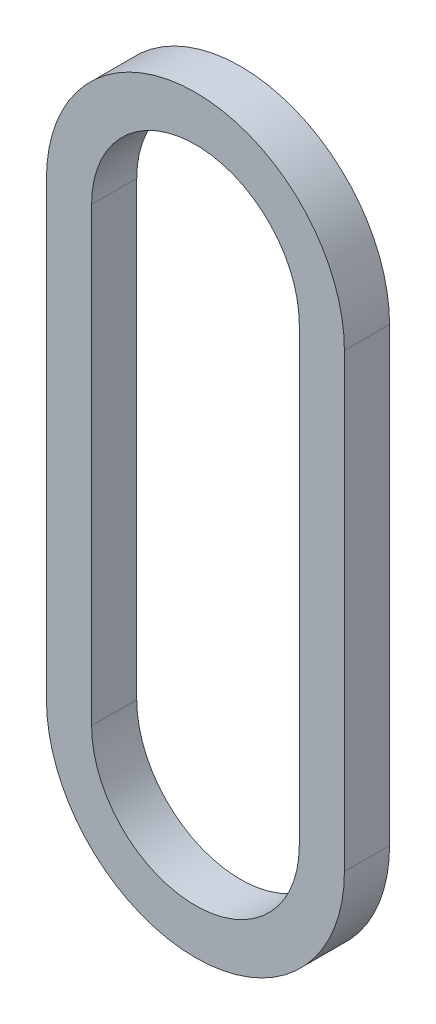
ISO-10303-21;
HEADER;
FILE_DESCRIPTION(('STEP AP214'),'2;1');
FILE_NAME('part.step','',(''),(''),'','','');
FILE_SCHEMA(('AUTOMOTIVE_DESIGN { 1 0 10303 214 1 1 1 1 }'));
ENDSEC;
DATA;
#1=APPLICATION_CONTEXT('core data for automotive mechanical design processes');
#2=APPLICATION_PROTOCOL_DEFINITION('international standard','automotive_design',2000,#1);
#3=PRODUCT_CONTEXT('',#1,'mechanical');
#4=PRODUCT('Part','Part','',(#3));
#5=PRODUCT_RELATED_PRODUCT_CATEGORY('part','',(#4));
#6=PRODUCT_DEFINITION_FORMATION('','',#4);
#7=PRODUCT_DEFINITION_CONTEXT('part definition',#1,'design');
#8=PRODUCT_DEFINITION('design','',#6,#7);
#9=PRODUCT_DEFINITION_SHAPE('','',#8);
#10=(LENGTH_UNIT() NAMED_UNIT(*) SI_UNIT(.MILLI.,.METRE.));
#11=(NAMED_UNIT(*) PLANE_ANGLE_UNIT() SI_UNIT($,.RADIAN.));
#12=(NAMED_UNIT(*) SI_UNIT($,.STERADIAN.) SOLID_ANGLE_UNIT());
#13=UNCERTAINTY_MEASURE_WITH_UNIT(LENGTH_MEASURE(1.E-05),#10,'distance_accuracy_value','');
#14=(GEOMETRIC_REPRESENTATION_CONTEXT(3) GLOBAL_UNCERTAINTY_ASSIGNED_CONTEXT((#13)) GLOBAL_UNIT_ASSIGNED_CONTEXT((#10,
#11,#12)) REPRESENTATION_CONTEXT('',''));
#15=CARTESIAN_POINT('',(0.,0.,0.));
#16=DIRECTION('',(0.,0.,1.));
#17=DIRECTION('',(1.,0.,0.));
#18=AXIS2_PLACEMENT_3D('',#15,#16,#17);
#19=CARTESIAN_POINT('',(0.,-50.,10.));
#20=DIRECTION('',(0.,0.,1.));
#21=DIRECTION('',(1.,0.,0.));
#22=AXIS2_PLACEMENT_3D('',#19,#20,#21);
#23=PLANE('',#22);
#24=CARTESIAN_POINT('',(0.,-50.,10.));
#25=DIRECTION('',(0.,0.,1.));
#26=DIRECTION('',(1.,0.,0.));
#27=AXIS2_PLACEMENT_3D('',#24,#25,#26);
#28=CIRCLE('',#27,33.);
#29=CARTESIAN_POINT('',(-33.,-50.,10.));
#30=VERTEX_POINT('',#29);
#31=CARTESIAN_POINT('',(33.,-50.,10.));
#32=VERTEX_POINT('',#31);
#33=EDGE_CURVE('E157',#30,#32,#28,.T.);
#34=ORIENTED_EDGE('',*,*,#33,.T.);
#35=DIRECTION('',(0.,1.,0.));
#36=VECTOR('',#35,1.);
#37=CARTESIAN_POINT('',(33.,-50.,10.));
#38=LINE('',#37,#36);
#39=CARTESIAN_POINT('',(33.,50.,10.));
#40=VERTEX_POINT('',#39);
#41=EDGE_CURVE('E162',#32,#40,#38,.T.);
#42=ORIENTED_EDGE('',*,*,#41,.T.);
#43=CARTESIAN_POINT('',(0.,50.,10.));
#44=DIRECTION('',(0.,0.,1.));
#45=DIRECTION('',(1.,0.,0.));
#46=AXIS2_PLACEMENT_3D('',#43,#44,#45);
#47=CIRCLE('',#46,33.);
#48=CARTESIAN_POINT('',(-33.,50.,10.));
#49=VERTEX_POINT('',#48);
#50=EDGE_CURVE('E170',#40,#49,#47,.T.);
#51=ORIENTED_EDGE('',*,*,#50,.T.);
#52=DIRECTION('',(0.,-1.,0.));
#53=VECTOR('',#52,1.);
#54=CARTESIAN_POINT('',(-33.,-50.,10.));
#55=LINE('',#54,#53);
#56=EDGE_CURVE('E168',#49,#30,#55,.T.);
#57=ORIENTED_EDGE('',*,*,#56,.T.);
#58=EDGE_LOOP('',(#34,#42,#51,#57));
#59=FACE_BOUND('',#58,.T.);
#60=DIRECTION('',(0.,1.,0.));
#61=VECTOR('',#60,1.);
#62=CARTESIAN_POINT('',(23.,-50.,10.));
#63=LINE('',#62,#61);
#64=CARTESIAN_POINT('',(23.,-50.,10.));
#65=VERTEX_POINT('',#64);
#66=CARTESIAN_POINT('',(23.,50.,10.));
#67=VERTEX_POINT('',#66);
#68=EDGE_CURVE('E119',#65,#67,#63,.T.);
#69=ORIENTED_EDGE('',*,*,#68,.F.);
#70=CARTESIAN_POINT('',(0.,-50.,10.));
#71=DIRECTION('',(0.,0.,1.));
#72=DIRECTION('',(1.,0.,0.));
#73=AXIS2_PLACEMENT_3D('',#70,#71,#72);
#74=CIRCLE('',#73,23.);
#75=CARTESIAN_POINT('',(-23.,-50.,10.));
#76=VERTEX_POINT('',#75);
#77=EDGE_CURVE('E112',#76,#65,#74,.T.);
#78=ORIENTED_EDGE('',*,*,#77,.F.);
#79=DIRECTION('',(0.,-1.,0.));
#80=VECTOR('',#79,1.);
#81=CARTESIAN_POINT('',(-23.,-50.,10.));
#82=LINE('',#81,#80);
#83=CARTESIAN_POINT('',(-23.,50.,10.));
#84=VERTEX_POINT('',#83);
#85=EDGE_CURVE('E139',#84,#76,#82,.T.);
#86=ORIENTED_EDGE('',*,*,#85,.F.);
#87=CARTESIAN_POINT('',(0.,50.,10.));
#88=DIRECTION('',(0.,0.,1.));
#89=DIRECTION('',(1.,0.,0.));
#90=AXIS2_PLACEMENT_3D('',#87,#88,#89);
#91=CIRCLE('',#90,23.);
#92=EDGE_CURVE('E132',#67,#84,#91,.T.);
#93=ORIENTED_EDGE('',*,*,#92,.F.);
#94=EDGE_LOOP('',(#69,#78,#86,#93));
#95=FACE_BOUND('',#94,.T.);
#96=ADVANCED_FACE('F44',(#59,#95),#23,.T.);
#97=CARTESIAN_POINT('',(0.,-50.,0.));
#98=DIRECTION('',(0.,0.,1.));
#99=DIRECTION('',(1.,0.,0.));
#100=AXIS2_PLACEMENT_3D('',#97,#98,#99);
#101=PLANE('',#100);
#102=CARTESIAN_POINT('',(0.,-50.,0.));
#103=DIRECTION('',(0.,0.,1.));
#104=DIRECTION('',(1.,0.,0.));
#105=AXIS2_PLACEMENT_3D('',#102,#103,#104);
#106=CIRCLE('',#105,33.);
#107=CARTESIAN_POINT('',(-33.,-50.,0.));
#108=VERTEX_POINT('',#107);
#109=CARTESIAN_POINT('',(33.,-50.,0.));
#110=VERTEX_POINT('',#109);
#111=EDGE_CURVE('E129',#108,#110,#106,.T.);
#112=ORIENTED_EDGE('',*,*,#111,.F.);
#113=DIRECTION('',(0.,-1.,0.));
#114=VECTOR('',#113,1.);
#115=CARTESIAN_POINT('',(-33.,-50.,0.));
#116=LINE('',#115,#114);
#117=CARTESIAN_POINT('',(-33.,50.,0.));
#118=VERTEX_POINT('',#117);
#119=EDGE_CURVE('E163',#118,#108,#116,.T.);
#120=ORIENTED_EDGE('',*,*,#119,.F.);
#121=CARTESIAN_POINT('',(0.,50.,0.));
#122=DIRECTION('',(0.,0.,1.));
#123=DIRECTION('',(1.,0.,0.));
#124=AXIS2_PLACEMENT_3D('',#121,#122,#123);
#125=CIRCLE('',#124,33.);
#126=CARTESIAN_POINT('',(33.,50.,0.));
#127=VERTEX_POINT('',#126);
#128=EDGE_CURVE('E178',#127,#118,#125,.T.);
#129=ORIENTED_EDGE('',*,*,#128,.F.);
#130=DIRECTION('',(0.,1.,0.));
#131=VECTOR('',#130,1.);
#132=CARTESIAN_POINT('',(33.,-50.,0.));
#133=LINE('',#132,#131);
#134=EDGE_CURVE('E179',#110,#127,#133,.T.);
#135=ORIENTED_EDGE('',*,*,#134,.F.);
#136=EDGE_LOOP('',(#112,#120,#129,#135));
#137=FACE_BOUND('',#136,.T.);
#138=CARTESIAN_POINT('',(0.,-50.,0.));
#139=DIRECTION('',(0.,0.,1.));
#140=DIRECTION('',(1.,0.,0.));
#141=AXIS2_PLACEMENT_3D('',#138,#139,#140);
#142=CIRCLE('',#141,23.);
#143=CARTESIAN_POINT('',(-23.,-50.,0.));
#144=VERTEX_POINT('',#143);
#145=CARTESIAN_POINT('',(23.,-50.,0.));
#146=VERTEX_POINT('',#145);
#147=EDGE_CURVE('E66',#144,#146,#142,.T.);
#148=ORIENTED_EDGE('',*,*,#147,.T.);
#149=DIRECTION('',(0.,1.,0.));
#150=VECTOR('',#149,1.);
#151=CARTESIAN_POINT('',(23.,-50.,0.));
#152=LINE('',#151,#150);
#153=CARTESIAN_POINT('',(23.,50.,0.));
#154=VERTEX_POINT('',#153);
#155=EDGE_CURVE('E130',#146,#154,#152,.T.);
#156=ORIENTED_EDGE('',*,*,#155,.T.);
#157=CARTESIAN_POINT('',(0.,50.,0.));
#158=DIRECTION('',(0.,0.,1.));
#159=DIRECTION('',(1.,0.,0.));
#160=AXIS2_PLACEMENT_3D('',#157,#158,#159);
#161=CIRCLE('',#160,23.);
#162=CARTESIAN_POINT('',(-23.,50.,0.));
#163=VERTEX_POINT('',#162);
#164=EDGE_CURVE('E148',#154,#163,#161,.T.);
#165=ORIENTED_EDGE('',*,*,#164,.T.);
#166=DIRECTION('',(0.,-1.,0.));
#167=VECTOR('',#166,1.);
#168=CARTESIAN_POINT('',(-23.,-50.,0.));
#169=LINE('',#168,#167);
#170=EDGE_CURVE('E122',#163,#144,#169,.T.);
#171=ORIENTED_EDGE('',*,*,#170,.T.);
#172=EDGE_LOOP('',(#148,#156,#165,#171));
#173=FACE_BOUND('',#172,.T.);
#174=ADVANCED_FACE('F201',(#137,#173),#101,.F.);
#175=CARTESIAN_POINT('',(0.,-50.,10.));
#176=DIRECTION('',(0.,0.,-1.));
#177=DIRECTION('',(-1.,0.,0.));
#178=AXIS2_PLACEMENT_3D('',#175,#176,#177);
#179=CYLINDRICAL_SURFACE('',#178,33.);
#180=ORIENTED_EDGE('',*,*,#111,.T.);
#181=DIRECTION('',(0.,0.,-1.));
#182=VECTOR('',#181,1.);
#183=CARTESIAN_POINT('',(33.,-50.,10.));
#184=LINE('',#183,#182);
#185=EDGE_CURVE('E11',#32,#110,#184,.T.);
#186=ORIENTED_EDGE('',*,*,#185,.F.);
#187=ORIENTED_EDGE('',*,*,#33,.F.);
#188=DIRECTION('',(0.,0.,-1.));
#189=VECTOR('',#188,1.);
#190=CARTESIAN_POINT('',(-33.,-50.,10.));
#191=LINE('',#190,#189);
#192=EDGE_CURVE('E172',#30,#108,#191,.T.);
#193=ORIENTED_EDGE('',*,*,#192,.T.);
#194=EDGE_LOOP('',(#180,#186,#187,#193));
#195=FACE_BOUND('',#194,.T.);
#196=ADVANCED_FACE('F50',(#195),#179,.T.);
#197=CARTESIAN_POINT('',(33.,-50.,10.));
#198=DIRECTION('',(-1.,0.,0.));
#199=DIRECTION('',(0.,-1.,0.));
#200=AXIS2_PLACEMENT_3D('',#197,#198,#199);
#201=PLANE('',#200);
#202=ORIENTED_EDGE('',*,*,#134,.T.);
#203=DIRECTION('',(0.,0.,-1.));
#204=VECTOR('',#203,1.);
#205=CARTESIAN_POINT('',(33.,50.,10.));
#206=LINE('',#205,#204);
#207=EDGE_CURVE('E53',#40,#127,#206,.T.);
#208=ORIENTED_EDGE('',*,*,#207,.F.);
#209=ORIENTED_EDGE('',*,*,#41,.F.);
#210=ORIENTED_EDGE('',*,*,#185,.T.);
#211=EDGE_LOOP('',(#202,#208,#209,#210));
#212=FACE_BOUND('',#211,.T.);
#213=ADVANCED_FACE('F213',(#212),#201,.F.);
#214=CARTESIAN_POINT('',(0.,50.,10.));
#215=DIRECTION('',(0.,0.,-1.));
#216=DIRECTION('',(-1.,0.,0.));
#217=AXIS2_PLACEMENT_3D('',#214,#215,#216);
#218=CYLINDRICAL_SURFACE('',#217,33.);
#219=ORIENTED_EDGE('',*,*,#128,.T.);
#220=DIRECTION('',(0.,0.,-1.));
#221=VECTOR('',#220,1.);
#222=CARTESIAN_POINT('',(-33.,50.,10.));
#223=LINE('',#222,#221);
#224=EDGE_CURVE('E187',#49,#118,#223,.T.);
#225=ORIENTED_EDGE('',*,*,#224,.F.);
#226=ORIENTED_EDGE('',*,*,#50,.F.);
#227=ORIENTED_EDGE('',*,*,#207,.T.);
#228=EDGE_LOOP('',(#219,#225,#226,#227));
#229=FACE_BOUND('',#228,.T.);
#230=ADVANCED_FACE('F197',(#229),#218,.T.);
#231=CARTESIAN_POINT('',(-33.,-50.,10.));
#232=DIRECTION('',(1.,0.,0.));
#233=DIRECTION('',(0.,0.,-1.));
#234=AXIS2_PLACEMENT_3D('',#231,#232,#233);
#235=PLANE('',#234);
#236=ORIENTED_EDGE('',*,*,#119,.T.);
#237=ORIENTED_EDGE('',*,*,#192,.F.);
#238=ORIENTED_EDGE('',*,*,#56,.F.);
#239=ORIENTED_EDGE('',*,*,#224,.T.);
#240=EDGE_LOOP('',(#236,#237,#238,#239));
#241=FACE_BOUND('',#240,.T.);
#242=ADVANCED_FACE('F210',(#241),#235,.F.);
#243=CARTESIAN_POINT('',(0.,-50.,10.));
#244=DIRECTION('',(0.,0.,-1.));
#245=DIRECTION('',(-1.,0.,0.));
#246=AXIS2_PLACEMENT_3D('',#243,#244,#245);
#247=CYLINDRICAL_SURFACE('',#246,23.);
#248=ORIENTED_EDGE('',*,*,#147,.F.);
#249=DIRECTION('',(0.,0.,-1.));
#250=VECTOR('',#249,1.);
#251=CARTESIAN_POINT('',(-23.,-50.,10.));
#252=LINE('',#251,#250);
#253=EDGE_CURVE('E113',#76,#144,#252,.T.);
#254=ORIENTED_EDGE('',*,*,#253,.F.);
#255=ORIENTED_EDGE('',*,*,#77,.T.);
#256=DIRECTION('',(0.,0.,-1.));
#257=VECTOR('',#256,1.);
#258=CARTESIAN_POINT('',(23.,-50.,10.));
#259=LINE('',#258,#257);
#260=EDGE_CURVE('E111',#65,#146,#259,.T.);
#261=ORIENTED_EDGE('',*,*,#260,.T.);
#262=EDGE_LOOP('',(#248,#254,#255,#261));
#263=FACE_BOUND('',#262,.T.);
#264=ADVANCED_FACE('F114',(#263),#247,.F.);
#265=CARTESIAN_POINT('',(23.,-50.,10.));
#266=DIRECTION('',(-1.,0.,0.));
#267=DIRECTION('',(0.,-1.,0.));
#268=AXIS2_PLACEMENT_3D('',#265,#266,#267);
#269=PLANE('',#268);
#270=ORIENTED_EDGE('',*,*,#155,.F.);
#271=ORIENTED_EDGE('',*,*,#260,.F.);
#272=ORIENTED_EDGE('',*,*,#68,.T.);
#273=DIRECTION('',(0.,0.,-1.));
#274=VECTOR('',#273,1.);
#275=CARTESIAN_POINT('',(23.,50.,10.));
#276=LINE('',#275,#274);
#277=EDGE_CURVE('E128',#67,#154,#276,.T.);
#278=ORIENTED_EDGE('',*,*,#277,.T.);
#279=EDGE_LOOP('',(#270,#271,#272,#278));
#280=FACE_BOUND('',#279,.T.);
#281=ADVANCED_FACE('F121',(#280),#269,.T.);
#282=CARTESIAN_POINT('',(0.,50.,10.));
#283=DIRECTION('',(0.,0.,-1.));
#284=DIRECTION('',(-1.,0.,0.));
#285=AXIS2_PLACEMENT_3D('',#282,#283,#284);
#286=CYLINDRICAL_SURFACE('',#285,23.);
#287=ORIENTED_EDGE('',*,*,#164,.F.);
#288=ORIENTED_EDGE('',*,*,#277,.F.);
#289=ORIENTED_EDGE('',*,*,#92,.T.);
#290=DIRECTION('',(0.,0.,-1.));
#291=VECTOR('',#290,1.);
#292=CARTESIAN_POINT('',(-23.,50.,10.));
#293=LINE('',#292,#291);
#294=EDGE_CURVE('E61',#84,#163,#293,.T.);
#295=ORIENTED_EDGE('',*,*,#294,.T.);
#296=EDGE_LOOP('',(#287,#288,#289,#295));
#297=FACE_BOUND('',#296,.T.);
#298=ADVANCED_FACE('F237',(#297),#286,.F.);
#299=CARTESIAN_POINT('',(-23.,-50.,10.));
#300=DIRECTION('',(1.,0.,0.));
#301=DIRECTION('',(0.,1.,0.));
#302=AXIS2_PLACEMENT_3D('',#299,#300,#301);
#303=PLANE('',#302);
#304=ORIENTED_EDGE('',*,*,#170,.F.);
#305=ORIENTED_EDGE('',*,*,#294,.F.);
#306=ORIENTED_EDGE('',*,*,#85,.T.);
#307=ORIENTED_EDGE('',*,*,#253,.T.);
#308=EDGE_LOOP('',(#304,#305,#306,#307));
#309=FACE_BOUND('',#308,.T.);
#310=ADVANCED_FACE('F238',(#309),#303,.T.);
#311=CLOSED_SHELL('',(#96,#174,#196,#213,#230,#242,#264,#281,#298,#310));
#312=MANIFOLD_SOLID_BREP('B2',#311);
#313=ADVANCED_BREP_SHAPE_REPRESENTATION('',(#18,#312),#14);
#314=SHAPE_DEFINITION_REPRESENTATION(#9,#313);
ENDSEC;
END-ISO-10303-21;
